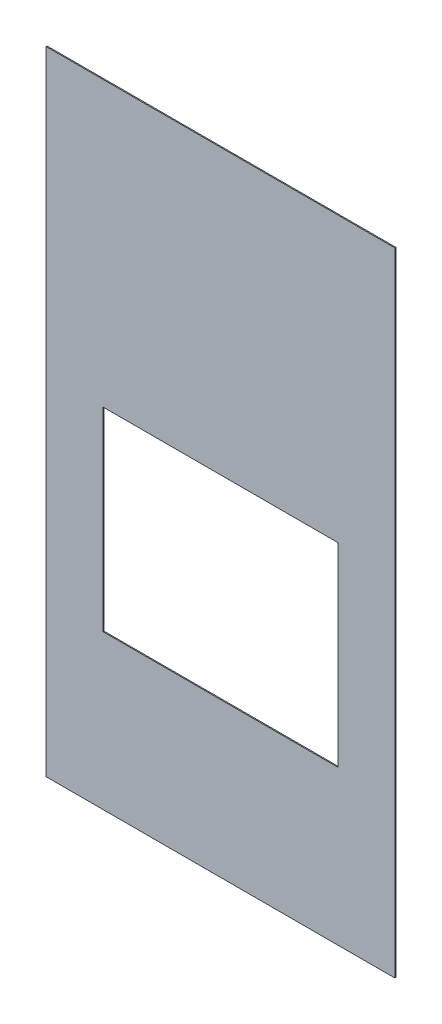
ISO-10303-21;
HEADER;
FILE_DESCRIPTION(('STEP AP214'),'2;1');
FILE_NAME('part.step','',(''),(''),'','','');
FILE_SCHEMA(('AUTOMOTIVE_DESIGN { 1 0 10303 214 1 1 1 1 }'));
ENDSEC;
DATA;
#1=APPLICATION_CONTEXT('core data for automotive mechanical design processes');
#2=APPLICATION_PROTOCOL_DEFINITION('international standard','automotive_design',2000,#1);
#3=PRODUCT_CONTEXT('',#1,'mechanical');
#4=PRODUCT('Part','Part','',(#3));
#5=PRODUCT_RELATED_PRODUCT_CATEGORY('part','',(#4));
#6=PRODUCT_DEFINITION_FORMATION('','',#4);
#7=PRODUCT_DEFINITION_CONTEXT('part definition',#1,'design');
#8=PRODUCT_DEFINITION('design','',#6,#7);
#9=PRODUCT_DEFINITION_SHAPE('','',#8);
#10=(LENGTH_UNIT() NAMED_UNIT(*) SI_UNIT(.MILLI.,.METRE.));
#11=(NAMED_UNIT(*) PLANE_ANGLE_UNIT() SI_UNIT($,.RADIAN.));
#12=(NAMED_UNIT(*) SI_UNIT($,.STERADIAN.) SOLID_ANGLE_UNIT());
#13=UNCERTAINTY_MEASURE_WITH_UNIT(LENGTH_MEASURE(1.E-05),#10,'distance_accuracy_value','');
#14=(GEOMETRIC_REPRESENTATION_CONTEXT(3) GLOBAL_UNCERTAINTY_ASSIGNED_CONTEXT((#13)) GLOBAL_UNIT_ASSIGNED_CONTEXT((#10,
#11,#12)) REPRESENTATION_CONTEXT('',''));
#15=CARTESIAN_POINT('',(0.,0.,0.));
#16=DIRECTION('',(0.,0.,1.));
#17=DIRECTION('',(1.,0.,0.));
#18=AXIS2_PLACEMENT_3D('',#15,#16,#17);
#19=CARTESIAN_POINT('',(-368.3,-508.,0.));
#20=DIRECTION('',(-1.,0.,0.));
#21=DIRECTION('',(0.,0.,1.));
#22=AXIS2_PLACEMENT_3D('',#19,#20,#21);
#23=PLANE('',#22);
#24=DIRECTION('',(0.,-1.,0.));
#25=VECTOR('',#24,1.);
#26=CARTESIAN_POINT('',(-368.3,101.6,-3.175));
#27=LINE('',#26,#25);
#28=CARTESIAN_POINT('',(-368.3,101.6,-3.175));
#29=VERTEX_POINT('',#28);
#30=CARTESIAN_POINT('',(-368.3,-508.,-3.175));
#31=VERTEX_POINT('',#30);
#32=EDGE_CURVE('E34',#29,#31,#27,.T.);
#33=ORIENTED_EDGE('',*,*,#32,.F.);
#34=DIRECTION('',(0.,0.,-1.));
#35=VECTOR('',#34,1.);
#36=CARTESIAN_POINT('',(-368.3,101.6,0.));
#37=LINE('',#36,#35);
#38=CARTESIAN_POINT('',(-368.3,101.6,0.));
#39=VERTEX_POINT('',#38);
#40=EDGE_CURVE('E114',#39,#29,#37,.T.);
#41=ORIENTED_EDGE('',*,*,#40,.F.);
#42=DIRECTION('',(0.,1.,0.));
#43=VECTOR('',#42,1.);
#44=CARTESIAN_POINT('',(-368.3,-508.,0.));
#45=LINE('',#44,#43);
#46=CARTESIAN_POINT('',(-368.3,-508.,0.));
#47=VERTEX_POINT('',#46);
#48=EDGE_CURVE('E174',#47,#39,#45,.T.);
#49=ORIENTED_EDGE('',*,*,#48,.F.);
#50=DIRECTION('',(0.,0.,-1.));
#51=VECTOR('',#50,1.);
#52=CARTESIAN_POINT('',(-368.3,-508.,0.));
#53=LINE('',#52,#51);
#54=EDGE_CURVE('E10',#47,#31,#53,.T.);
#55=ORIENTED_EDGE('',*,*,#54,.T.);
#56=EDGE_LOOP('',(#33,#41,#49,#55));
#57=FACE_BOUND('',#56,.T.);
#58=ADVANCED_FACE('F16',(#57),#23,.F.);
#59=CARTESIAN_POINT('',(368.3,-508.,0.));
#60=DIRECTION('',(0.,-1.,0.));
#61=DIRECTION('',(0.,0.,-1.));
#62=AXIS2_PLACEMENT_3D('',#59,#60,#61);
#63=PLANE('',#62);
#64=DIRECTION('',(1.,0.,0.));
#65=VECTOR('',#64,1.);
#66=CARTESIAN_POINT('',(-368.3,-508.,-3.175));
#67=LINE('',#66,#65);
#68=CARTESIAN_POINT('',(368.3,-508.,-3.175));
#69=VERTEX_POINT('',#68);
#70=EDGE_CURVE('E128',#31,#69,#67,.T.);
#71=ORIENTED_EDGE('',*,*,#70,.F.);
#72=ORIENTED_EDGE('',*,*,#54,.F.);
#73=DIRECTION('',(-1.,0.,0.));
#74=VECTOR('',#73,1.);
#75=CARTESIAN_POINT('',(368.3,-508.,0.));
#76=LINE('',#75,#74);
#77=CARTESIAN_POINT('',(368.3,-508.,0.));
#78=VERTEX_POINT('',#77);
#79=EDGE_CURVE('E176',#78,#47,#76,.T.);
#80=ORIENTED_EDGE('',*,*,#79,.F.);
#81=DIRECTION('',(0.,0.,-1.));
#82=VECTOR('',#81,1.);
#83=CARTESIAN_POINT('',(368.3,-508.,0.));
#84=LINE('',#83,#82);
#85=EDGE_CURVE('E26',#78,#69,#84,.T.);
#86=ORIENTED_EDGE('',*,*,#85,.T.);
#87=EDGE_LOOP('',(#71,#72,#80,#86));
#88=FACE_BOUND('',#87,.T.);
#89=ADVANCED_FACE('F145',(#88),#63,.F.);
#90=CARTESIAN_POINT('',(368.3,101.6,0.));
#91=DIRECTION('',(1.,0.,0.));
#92=DIRECTION('',(0.,0.,-1.));
#93=AXIS2_PLACEMENT_3D('',#90,#91,#92);
#94=PLANE('',#93);
#95=DIRECTION('',(0.,1.,0.));
#96=VECTOR('',#95,1.);
#97=CARTESIAN_POINT('',(368.3,-508.,-3.175));
#98=LINE('',#97,#96);
#99=CARTESIAN_POINT('',(368.3,101.6,-3.175));
#100=VERTEX_POINT('',#99);
#101=EDGE_CURVE('E109',#69,#100,#98,.T.);
#102=ORIENTED_EDGE('',*,*,#101,.F.);
#103=ORIENTED_EDGE('',*,*,#85,.F.);
#104=DIRECTION('',(0.,-1.,0.));
#105=VECTOR('',#104,1.);
#106=CARTESIAN_POINT('',(368.3,101.6,0.));
#107=LINE('',#106,#105);
#108=CARTESIAN_POINT('',(368.3,101.6,0.));
#109=VERTEX_POINT('',#108);
#110=EDGE_CURVE('E127',#109,#78,#107,.T.);
#111=ORIENTED_EDGE('',*,*,#110,.F.);
#112=DIRECTION('',(0.,0.,-1.));
#113=VECTOR('',#112,1.);
#114=CARTESIAN_POINT('',(368.3,101.6,0.));
#115=LINE('',#114,#113);
#116=EDGE_CURVE('E117',#109,#100,#115,.T.);
#117=ORIENTED_EDGE('',*,*,#116,.T.);
#118=EDGE_LOOP('',(#102,#103,#111,#117));
#119=FACE_BOUND('',#118,.T.);
#120=ADVANCED_FACE('F150',(#119),#94,.F.);
#121=CARTESIAN_POINT('',(-368.3,101.6,0.));
#122=DIRECTION('',(0.,1.,0.));
#123=DIRECTION('',(0.,0.,1.));
#124=AXIS2_PLACEMENT_3D('',#121,#122,#123);
#125=PLANE('',#124);
#126=DIRECTION('',(-1.,0.,0.));
#127=VECTOR('',#126,1.);
#128=CARTESIAN_POINT('',(368.3,101.6,-3.175));
#129=LINE('',#128,#127);
#130=EDGE_CURVE('E164',#100,#29,#129,.T.);
#131=ORIENTED_EDGE('',*,*,#130,.F.);
#132=ORIENTED_EDGE('',*,*,#116,.F.);
#133=DIRECTION('',(1.,0.,0.));
#134=VECTOR('',#133,1.);
#135=CARTESIAN_POINT('',(-368.3,101.6,0.));
#136=LINE('',#135,#134);
#137=EDGE_CURVE('E173',#39,#109,#136,.T.);
#138=ORIENTED_EDGE('',*,*,#137,.F.);
#139=ORIENTED_EDGE('',*,*,#40,.T.);
#140=EDGE_LOOP('',(#131,#132,#138,#139));
#141=FACE_BOUND('',#140,.T.);
#142=ADVANCED_FACE('F142',(#141),#125,.F.);
#143=CARTESIAN_POINT('',(546.1,990.6,0.));
#144=DIRECTION('',(1.,0.,0.));
#145=DIRECTION('',(0.,0.,-1.));
#146=AXIS2_PLACEMENT_3D('',#143,#144,#145);
#147=PLANE('',#146);
#148=DIRECTION('',(0.,1.,0.));
#149=VECTOR('',#148,1.);
#150=CARTESIAN_POINT('',(546.1,-990.6,0.));
#151=LINE('',#150,#149);
#152=CARTESIAN_POINT('',(546.1,-990.6,0.));
#153=VERTEX_POINT('',#152);
#154=CARTESIAN_POINT('',(546.1,990.6,0.));
#155=VERTEX_POINT('',#154);
#156=EDGE_CURVE('E113',#153,#155,#151,.T.);
#157=ORIENTED_EDGE('',*,*,#156,.F.);
#158=DIRECTION('',(0.,0.,-1.));
#159=VECTOR('',#158,1.);
#160=CARTESIAN_POINT('',(546.1,-990.6,0.));
#161=LINE('',#160,#159);
#162=CARTESIAN_POINT('',(546.1,-990.6,-3.175));
#163=VERTEX_POINT('',#162);
#164=EDGE_CURVE('E111',#153,#163,#161,.T.);
#165=ORIENTED_EDGE('',*,*,#164,.T.);
#166=DIRECTION('',(0.,-1.,0.));
#167=VECTOR('',#166,1.);
#168=CARTESIAN_POINT('',(546.1,990.6,-3.175));
#169=LINE('',#168,#167);
#170=CARTESIAN_POINT('',(546.1,990.6,-3.175));
#171=VERTEX_POINT('',#170);
#172=EDGE_CURVE('E104',#171,#163,#169,.T.);
#173=ORIENTED_EDGE('',*,*,#172,.F.);
#174=DIRECTION('',(0.,0.,-1.));
#175=VECTOR('',#174,1.);
#176=CARTESIAN_POINT('',(546.1,990.6,0.));
#177=LINE('',#176,#175);
#178=EDGE_CURVE('E115',#155,#171,#177,.T.);
#179=ORIENTED_EDGE('',*,*,#178,.F.);
#180=EDGE_LOOP('',(#157,#165,#173,#179));
#181=FACE_BOUND('',#180,.T.);
#182=ADVANCED_FACE('F112',(#181),#147,.T.);
#183=CARTESIAN_POINT('',(-546.1,990.6,0.));
#184=DIRECTION('',(0.,1.,0.));
#185=DIRECTION('',(0.,0.,1.));
#186=AXIS2_PLACEMENT_3D('',#183,#184,#185);
#187=PLANE('',#186);
#188=DIRECTION('',(-1.,0.,0.));
#189=VECTOR('',#188,1.);
#190=CARTESIAN_POINT('',(546.1,990.6,0.));
#191=LINE('',#190,#189);
#192=CARTESIAN_POINT('',(-546.1,990.6,0.));
#193=VERTEX_POINT('',#192);
#194=EDGE_CURVE('E123',#155,#193,#191,.T.);
#195=ORIENTED_EDGE('',*,*,#194,.F.);
#196=ORIENTED_EDGE('',*,*,#178,.T.);
#197=DIRECTION('',(1.,0.,0.));
#198=VECTOR('',#197,1.);
#199=CARTESIAN_POINT('',(-546.1,990.6,-3.175));
#200=LINE('',#199,#198);
#201=CARTESIAN_POINT('',(-546.1,990.6,-3.175));
#202=VERTEX_POINT('',#201);
#203=EDGE_CURVE('E94',#202,#171,#200,.T.);
#204=ORIENTED_EDGE('',*,*,#203,.F.);
#205=DIRECTION('',(0.,0.,-1.));
#206=VECTOR('',#205,1.);
#207=CARTESIAN_POINT('',(-546.1,990.6,0.));
#208=LINE('',#207,#206);
#209=EDGE_CURVE('E90',#193,#202,#208,.T.);
#210=ORIENTED_EDGE('',*,*,#209,.F.);
#211=EDGE_LOOP('',(#195,#196,#204,#210));
#212=FACE_BOUND('',#211,.T.);
#213=ADVANCED_FACE('F133',(#212),#187,.T.);
#214=CARTESIAN_POINT('',(-546.1,-990.6,0.));
#215=DIRECTION('',(-1.,0.,0.));
#216=DIRECTION('',(0.,0.,1.));
#217=AXIS2_PLACEMENT_3D('',#214,#215,#216);
#218=PLANE('',#217);
#219=DIRECTION('',(0.,-1.,0.));
#220=VECTOR('',#219,1.);
#221=CARTESIAN_POINT('',(-546.1,990.6,0.));
#222=LINE('',#221,#220);
#223=CARTESIAN_POINT('',(-546.1,-990.6,0.));
#224=VERTEX_POINT('',#223);
#225=EDGE_CURVE('E78',#193,#224,#222,.T.);
#226=ORIENTED_EDGE('',*,*,#225,.F.);
#227=ORIENTED_EDGE('',*,*,#209,.T.);
#228=DIRECTION('',(0.,1.,0.));
#229=VECTOR('',#228,1.);
#230=CARTESIAN_POINT('',(-546.1,-990.6,-3.175));
#231=LINE('',#230,#229);
#232=CARTESIAN_POINT('',(-546.1,-990.6,-3.175));
#233=VERTEX_POINT('',#232);
#234=EDGE_CURVE('E84',#233,#202,#231,.T.);
#235=ORIENTED_EDGE('',*,*,#234,.F.);
#236=DIRECTION('',(0.,0.,-1.));
#237=VECTOR('',#236,1.);
#238=CARTESIAN_POINT('',(-546.1,-990.6,0.));
#239=LINE('',#238,#237);
#240=EDGE_CURVE('E87',#224,#233,#239,.T.);
#241=ORIENTED_EDGE('',*,*,#240,.F.);
#242=EDGE_LOOP('',(#226,#227,#235,#241));
#243=FACE_BOUND('',#242,.T.);
#244=ADVANCED_FACE('F86',(#243),#218,.T.);
#245=CARTESIAN_POINT('',(546.1,-990.6,0.));
#246=DIRECTION('',(0.,-1.,0.));
#247=DIRECTION('',(0.,0.,-1.));
#248=AXIS2_PLACEMENT_3D('',#245,#246,#247);
#249=PLANE('',#248);
#250=DIRECTION('',(1.,0.,0.));
#251=VECTOR('',#250,1.);
#252=CARTESIAN_POINT('',(-546.1,-990.6,0.));
#253=LINE('',#252,#251);
#254=EDGE_CURVE('E100',#224,#153,#253,.T.);
#255=ORIENTED_EDGE('',*,*,#254,.F.);
#256=ORIENTED_EDGE('',*,*,#240,.T.);
#257=DIRECTION('',(-1.,0.,0.));
#258=VECTOR('',#257,1.);
#259=CARTESIAN_POINT('',(546.1,-990.6,-3.175));
#260=LINE('',#259,#258);
#261=EDGE_CURVE('E20',#163,#233,#260,.T.);
#262=ORIENTED_EDGE('',*,*,#261,.F.);
#263=ORIENTED_EDGE('',*,*,#164,.F.);
#264=EDGE_LOOP('',(#255,#256,#262,#263));
#265=FACE_BOUND('',#264,.T.);
#266=ADVANCED_FACE('F98',(#265),#249,.T.);
#267=CARTESIAN_POINT('',(0.,0.,-3.175));
#268=DIRECTION('',(0.,0.,1.));
#269=DIRECTION('',(1.,0.,0.));
#270=AXIS2_PLACEMENT_3D('',#267,#268,#269);
#271=PLANE('',#270);
#272=ORIENTED_EDGE('',*,*,#261,.T.);
#273=ORIENTED_EDGE('',*,*,#234,.T.);
#274=ORIENTED_EDGE('',*,*,#203,.T.);
#275=ORIENTED_EDGE('',*,*,#172,.T.);
#276=EDGE_LOOP('',(#272,#273,#274,#275));
#277=FACE_BOUND('',#276,.T.);
#278=ORIENTED_EDGE('',*,*,#101,.T.);
#279=ORIENTED_EDGE('',*,*,#130,.T.);
#280=ORIENTED_EDGE('',*,*,#32,.T.);
#281=ORIENTED_EDGE('',*,*,#70,.T.);
#282=EDGE_LOOP('',(#278,#279,#280,#281));
#283=FACE_BOUND('',#282,.T.);
#284=ADVANCED_FACE('F102',(#277,#283),#271,.F.);
#285=CARTESIAN_POINT('',(0.,0.,0.));
#286=DIRECTION('',(0.,0.,1.));
#287=DIRECTION('',(1.,0.,0.));
#288=AXIS2_PLACEMENT_3D('',#285,#286,#287);
#289=PLANE('',#288);
#290=ORIENTED_EDGE('',*,*,#254,.T.);
#291=ORIENTED_EDGE('',*,*,#156,.T.);
#292=ORIENTED_EDGE('',*,*,#194,.T.);
#293=ORIENTED_EDGE('',*,*,#225,.T.);
#294=EDGE_LOOP('',(#290,#291,#292,#293));
#295=FACE_BOUND('',#294,.T.);
#296=ORIENTED_EDGE('',*,*,#110,.T.);
#297=ORIENTED_EDGE('',*,*,#79,.T.);
#298=ORIENTED_EDGE('',*,*,#48,.T.);
#299=ORIENTED_EDGE('',*,*,#137,.T.);
#300=EDGE_LOOP('',(#296,#297,#298,#299));
#301=FACE_BOUND('',#300,.T.);
#302=ADVANCED_FACE('F18',(#295,#301),#289,.T.);
#303=CLOSED_SHELL('',(#58,#89,#120,#142,#182,#213,#244,#266,#284,#302));
#304=MANIFOLD_SOLID_BREP('B1',#303);
#305=ADVANCED_BREP_SHAPE_REPRESENTATION('',(#18,#304),#14);
#306=SHAPE_DEFINITION_REPRESENTATION(#9,#305);
ENDSEC;
END-ISO-10303-21;
